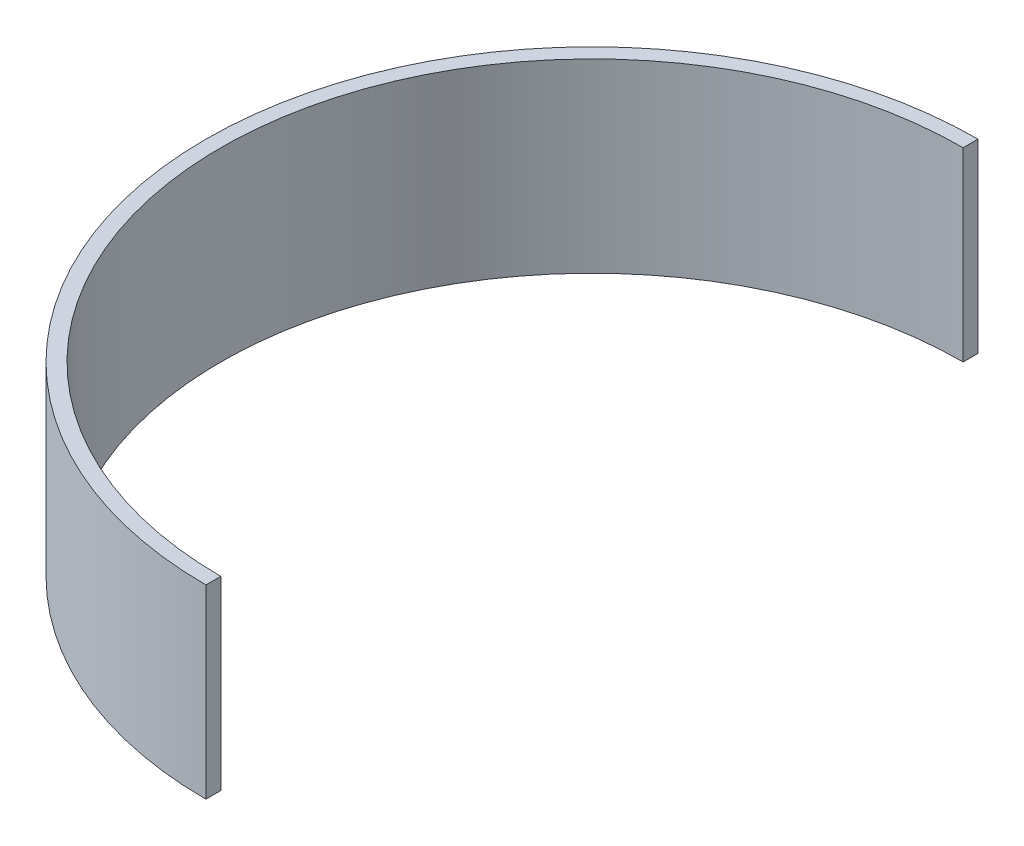
ISO-10303-21;
HEADER;
FILE_DESCRIPTION(('STEP AP214'),'2;1');
FILE_NAME('part.step','',(''),(''),'','','');
FILE_SCHEMA(('AUTOMOTIVE_DESIGN { 1 0 10303 214 1 1 1 1 }'));
ENDSEC;
DATA;
#1=APPLICATION_CONTEXT('core data for automotive mechanical design processes');
#2=APPLICATION_PROTOCOL_DEFINITION('international standard','automotive_design',2000,#1);
#3=PRODUCT_CONTEXT('',#1,'mechanical');
#4=PRODUCT('Part','Part','',(#3));
#5=PRODUCT_RELATED_PRODUCT_CATEGORY('part','',(#4));
#6=PRODUCT_DEFINITION_FORMATION('','',#4);
#7=PRODUCT_DEFINITION_CONTEXT('part definition',#1,'design');
#8=PRODUCT_DEFINITION('design','',#6,#7);
#9=PRODUCT_DEFINITION_SHAPE('','',#8);
#10=(LENGTH_UNIT() NAMED_UNIT(*) SI_UNIT(.MILLI.,.METRE.));
#11=(NAMED_UNIT(*) PLANE_ANGLE_UNIT() SI_UNIT($,.RADIAN.));
#12=(NAMED_UNIT(*) SI_UNIT($,.STERADIAN.) SOLID_ANGLE_UNIT());
#13=UNCERTAINTY_MEASURE_WITH_UNIT(LENGTH_MEASURE(1.E-05),#10,'distance_accuracy_value','');
#14=(GEOMETRIC_REPRESENTATION_CONTEXT(3) GLOBAL_UNCERTAINTY_ASSIGNED_CONTEXT((#13)) GLOBAL_UNIT_ASSIGNED_CONTEXT((#10,
#11,#12)) REPRESENTATION_CONTEXT('',''));
#15=CARTESIAN_POINT('',(0.,0.,0.));
#16=DIRECTION('',(0.,0.,1.));
#17=DIRECTION('',(1.,0.,0.));
#18=AXIS2_PLACEMENT_3D('',#15,#16,#17);
#19=CARTESIAN_POINT('',(0.,2.5,0.));
#20=DIRECTION('',(0.,-1.,0.));
#21=DIRECTION('',(0.,0.,-1.));
#22=AXIS2_PLACEMENT_3D('',#19,#20,#21);
#23=CYLINDRICAL_SURFACE('',#22,5.2);
#24=DIRECTION('',(0.,-1.,0.));
#25=VECTOR('',#24,1.);
#26=CARTESIAN_POINT('',(0.,2.5,5.2));
#27=LINE('',#26,#25);
#28=CARTESIAN_POINT('',(0.,2.5,5.2));
#29=VERTEX_POINT('',#28);
#30=CARTESIAN_POINT('',(0.,0.,5.2));
#31=VERTEX_POINT('',#30);
#32=EDGE_CURVE('E95',#29,#31,#27,.T.);
#33=ORIENTED_EDGE('',*,*,#32,.F.);
#34=CARTESIAN_POINT('',(0.,2.5,0.));
#35=DIRECTION('',(0.,1.,0.));
#36=DIRECTION('',(0.,0.,1.));
#37=AXIS2_PLACEMENT_3D('',#34,#35,#36);
#38=CIRCLE('',#37,5.2);
#39=CARTESIAN_POINT('',(0.,2.5,-5.2));
#40=VERTEX_POINT('',#39);
#41=EDGE_CURVE('E89',#40,#29,#38,.T.);
#42=ORIENTED_EDGE('',*,*,#41,.F.);
#43=DIRECTION('',(0.,-1.,0.));
#44=VECTOR('',#43,1.);
#45=CARTESIAN_POINT('',(0.,2.5,-5.2));
#46=LINE('',#45,#44);
#47=CARTESIAN_POINT('',(0.,0.,-5.2));
#48=VERTEX_POINT('',#47);
#49=EDGE_CURVE('E75',#48,#40,#46,.F.);
#50=ORIENTED_EDGE('',*,*,#49,.F.);
#51=CARTESIAN_POINT('',(0.,0.,0.));
#52=DIRECTION('',(0.,1.,0.));
#53=DIRECTION('',(0.,0.,1.));
#54=AXIS2_PLACEMENT_3D('',#51,#52,#53);
#55=CIRCLE('',#54,5.2);
#56=EDGE_CURVE('E96',#48,#31,#55,.T.);
#57=ORIENTED_EDGE('',*,*,#56,.T.);
#58=EDGE_LOOP('',(#33,#42,#50,#57));
#59=FACE_BOUND('',#58,.T.);
#60=ADVANCED_FACE('F38',(#59),#23,.T.);
#61=CARTESIAN_POINT('',(0.,2.5,0.));
#62=DIRECTION('',(0.,1.,0.));
#63=DIRECTION('',(0.,0.,1.));
#64=AXIS2_PLACEMENT_3D('',#61,#62,#63);
#65=PLANE('',#64);
#66=ORIENTED_EDGE('',*,*,#41,.T.);
#67=DIRECTION('',(0.,0.,1.));
#68=VECTOR('',#67,1.);
#69=CARTESIAN_POINT('',(0.,2.5,-6.97071355032865));
#70=LINE('',#69,#68);
#71=CARTESIAN_POINT('',(0.,2.5,5.));
#72=VERTEX_POINT('',#71);
#73=EDGE_CURVE('E92',#72,#29,#70,.T.);
#74=ORIENTED_EDGE('',*,*,#73,.F.);
#75=CARTESIAN_POINT('',(0.,2.5,0.));
#76=DIRECTION('',(0.,1.,0.));
#77=DIRECTION('',(0.,0.,1.));
#78=AXIS2_PLACEMENT_3D('',#75,#76,#77);
#79=CIRCLE('',#78,5.);
#80=CARTESIAN_POINT('',(0.,2.5,-5.));
#81=VERTEX_POINT('',#80);
#82=EDGE_CURVE('E91',#81,#72,#79,.T.);
#83=ORIENTED_EDGE('',*,*,#82,.F.);
#84=EDGE_CURVE('E59',#40,#81,#70,.T.);
#85=ORIENTED_EDGE('',*,*,#84,.F.);
#86=EDGE_LOOP('',(#66,#74,#83,#85));
#87=FACE_BOUND('',#86,.T.);
#88=ADVANCED_FACE('F87',(#87),#65,.T.);
#89=CARTESIAN_POINT('',(0.,0.,0.));
#90=DIRECTION('',(0.,1.,0.));
#91=DIRECTION('',(0.,0.,1.));
#92=AXIS2_PLACEMENT_3D('',#89,#90,#91);
#93=PLANE('',#92);
#94=DIRECTION('',(0.,0.,-1.));
#95=VECTOR('',#94,1.);
#96=CARTESIAN_POINT('',(0.,0.,0.));
#97=LINE('',#96,#95);
#98=CARTESIAN_POINT('',(0.,0.,5.));
#99=VERTEX_POINT('',#98);
#100=EDGE_CURVE('E52',#31,#99,#97,.T.);
#101=ORIENTED_EDGE('',*,*,#100,.F.);
#102=ORIENTED_EDGE('',*,*,#56,.F.);
#103=CARTESIAN_POINT('',(0.,0.,-5.));
#104=VERTEX_POINT('',#103);
#105=EDGE_CURVE('E78',#104,#48,#97,.T.);
#106=ORIENTED_EDGE('',*,*,#105,.F.);
#107=CARTESIAN_POINT('',(0.,0.,0.));
#108=DIRECTION('',(0.,1.,0.));
#109=DIRECTION('',(0.,0.,1.));
#110=AXIS2_PLACEMENT_3D('',#107,#108,#109);
#111=CIRCLE('',#110,5.);
#112=EDGE_CURVE('E98',#99,#104,#111,.F.);
#113=ORIENTED_EDGE('',*,*,#112,.F.);
#114=EDGE_LOOP('',(#101,#102,#106,#113));
#115=FACE_BOUND('',#114,.T.);
#116=ADVANCED_FACE('F110',(#115),#93,.F.);
#117=CARTESIAN_POINT('',(0.,2.5,0.));
#118=DIRECTION('',(0.,-1.,0.));
#119=DIRECTION('',(0.,0.,-1.));
#120=AXIS2_PLACEMENT_3D('',#117,#118,#119);
#121=CYLINDRICAL_SURFACE('',#120,5.);
#122=ORIENTED_EDGE('',*,*,#82,.T.);
#123=DIRECTION('',(0.,-1.,0.));
#124=VECTOR('',#123,1.);
#125=CARTESIAN_POINT('',(0.,2.5,5.));
#126=LINE('',#125,#124);
#127=EDGE_CURVE('E11',#72,#99,#126,.T.);
#128=ORIENTED_EDGE('',*,*,#127,.T.);
#129=ORIENTED_EDGE('',*,*,#112,.T.);
#130=DIRECTION('',(0.,-1.,0.));
#131=VECTOR('',#130,1.);
#132=CARTESIAN_POINT('',(0.,2.5,-5.));
#133=LINE('',#132,#131);
#134=EDGE_CURVE('E45',#104,#81,#133,.F.);
#135=ORIENTED_EDGE('',*,*,#134,.T.);
#136=EDGE_LOOP('',(#122,#128,#129,#135));
#137=FACE_BOUND('',#136,.T.);
#138=ADVANCED_FACE('F108',(#137),#121,.F.);
#139=CARTESIAN_POINT('',(0.,2.5,-6.97071355032865));
#140=DIRECTION('',(1.,0.,0.));
#141=DIRECTION('',(0.,0.,-1.));
#142=AXIS2_PLACEMENT_3D('',#139,#140,#141);
#143=PLANE('',#142);
#144=ORIENTED_EDGE('',*,*,#49,.T.);
#145=ORIENTED_EDGE('',*,*,#84,.T.);
#146=ORIENTED_EDGE('',*,*,#134,.F.);
#147=ORIENTED_EDGE('',*,*,#105,.T.);
#148=EDGE_LOOP('',(#144,#145,#146,#147));
#149=FACE_BOUND('',#148,.T.);
#150=ADVANCED_FACE('F76',(#149),#143,.T.);
#151=ORIENTED_EDGE('',*,*,#32,.T.);
#152=ORIENTED_EDGE('',*,*,#100,.T.);
#153=ORIENTED_EDGE('',*,*,#127,.F.);
#154=ORIENTED_EDGE('',*,*,#73,.T.);
#155=EDGE_LOOP('',(#151,#152,#153,#154));
#156=FACE_BOUND('',#155,.T.);
#157=ADVANCED_FACE('F107',(#156),#143,.T.);
#158=CLOSED_SHELL('',(#60,#88,#116,#138,#150,#157));
#159=MANIFOLD_SOLID_BREP('B2',#158);
#160=ADVANCED_BREP_SHAPE_REPRESENTATION('',(#18,#159),#14);
#161=SHAPE_DEFINITION_REPRESENTATION(#9,#160);
ENDSEC;
END-ISO-10303-21;
